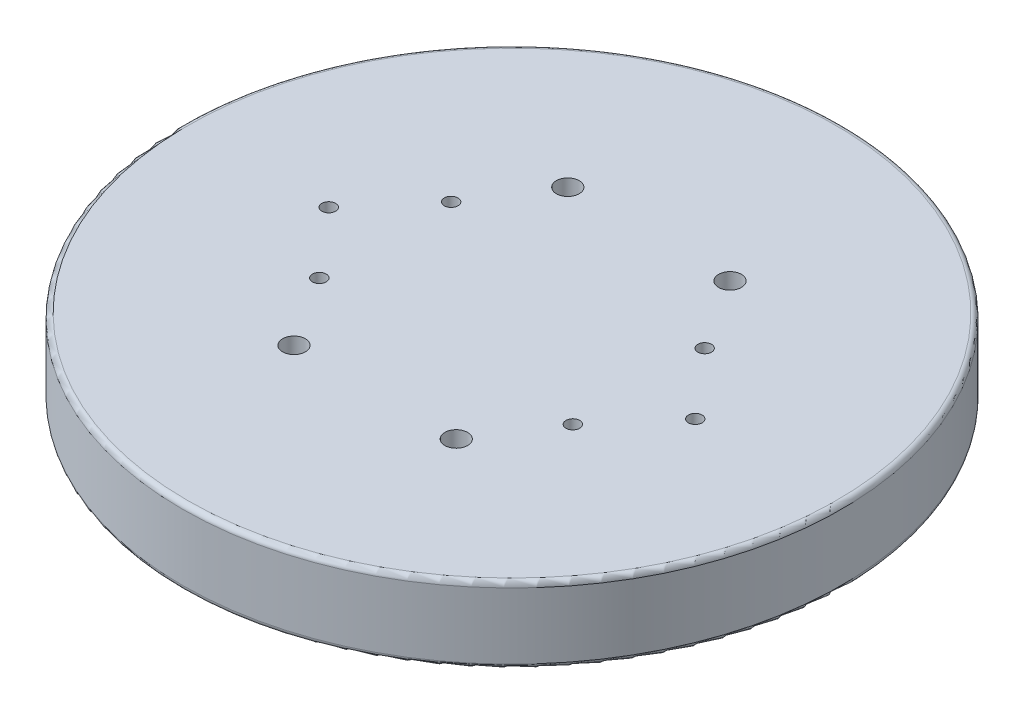
ISO-10303-21;
HEADER;
FILE_DESCRIPTION(('STEP AP214'),'2;1');
FILE_NAME('part.step','',(''),(''),'','','');
FILE_SCHEMA(('AUTOMOTIVE_DESIGN { 1 0 10303 214 1 1 1 1 }'));
ENDSEC;
DATA;
#1=APPLICATION_CONTEXT('core data for automotive mechanical design processes');
#2=APPLICATION_PROTOCOL_DEFINITION('international standard','automotive_design',2000,#1);
#3=PRODUCT_CONTEXT('',#1,'mechanical');
#4=PRODUCT('Part','Part','',(#3));
#5=PRODUCT_RELATED_PRODUCT_CATEGORY('part','',(#4));
#6=PRODUCT_DEFINITION_FORMATION('','',#4);
#7=PRODUCT_DEFINITION_CONTEXT('part definition',#1,'design');
#8=PRODUCT_DEFINITION('design','',#6,#7);
#9=PRODUCT_DEFINITION_SHAPE('','',#8);
#10=(LENGTH_UNIT() NAMED_UNIT(*) SI_UNIT(.MILLI.,.METRE.));
#11=(NAMED_UNIT(*) PLANE_ANGLE_UNIT() SI_UNIT($,.RADIAN.));
#12=(NAMED_UNIT(*) SI_UNIT($,.STERADIAN.) SOLID_ANGLE_UNIT());
#13=UNCERTAINTY_MEASURE_WITH_UNIT(LENGTH_MEASURE(1.E-05),#10,'distance_accuracy_value','');
#14=(GEOMETRIC_REPRESENTATION_CONTEXT(3) GLOBAL_UNCERTAINTY_ASSIGNED_CONTEXT((#13)) GLOBAL_UNIT_ASSIGNED_CONTEXT((#10,
#11,#12)) REPRESENTATION_CONTEXT('',''));
#15=CARTESIAN_POINT('',(0.,0.,0.));
#16=DIRECTION('',(0.,0.,1.));
#17=DIRECTION('',(1.,0.,0.));
#18=AXIS2_PLACEMENT_3D('',#15,#16,#17);
#19=CARTESIAN_POINT('',(0.,15.,0.));
#20=DIRECTION('',(0.,1.,0.));
#21=DIRECTION('',(0.,0.,1.));
#22=AXIS2_PLACEMENT_3D('',#19,#20,#21);
#23=PLANE('',#22);
#24=CARTESIAN_POINT('',(-16.,15.,27.));
#25=DIRECTION('',(0.,-1.,0.));
#26=DIRECTION('',(0.,0.,-1.));
#27=AXIS2_PLACEMENT_3D('',#24,#25,#26);
#28=CIRCLE('',#27,2.2479);
#29=CARTESIAN_POINT('',(-16.,15.,24.7521));
#30=VERTEX_POINT('',#29);
#31=EDGE_CURVE('E107',#30,#30,#28,.T.);
#32=ORIENTED_EDGE('',*,*,#31,.T.);
#33=EDGE_LOOP('',(#32));
#34=FACE_BOUND('',#33,.T.);
#35=CARTESIAN_POINT('',(16.,15.,27.));
#36=DIRECTION('',(0.,-1.,0.));
#37=DIRECTION('',(0.,0.,-1.));
#38=AXIS2_PLACEMENT_3D('',#35,#36,#37);
#39=CIRCLE('',#38,2.24789999999999);
#40=CARTESIAN_POINT('',(16.,15.,24.7521));
#41=VERTEX_POINT('',#40);
#42=EDGE_CURVE('E101',#41,#41,#39,.T.);
#43=ORIENTED_EDGE('',*,*,#42,.T.);
#44=EDGE_LOOP('',(#43));
#45=FACE_BOUND('',#44,.T.);
#46=CARTESIAN_POINT('',(25.,15.,13.));
#47=DIRECTION('',(0.,-1.,0.));
#48=DIRECTION('',(0.,0.,-1.));
#49=AXIS2_PLACEMENT_3D('',#46,#47,#48);
#50=CIRCLE('',#49,1.35254999999999);
#51=CARTESIAN_POINT('',(25.,15.,11.64745));
#52=VERTEX_POINT('',#51);
#53=EDGE_CURVE('E59',#52,#52,#50,.T.);
#54=ORIENTED_EDGE('',*,*,#53,.T.);
#55=EDGE_LOOP('',(#54));
#56=FACE_BOUND('',#55,.T.);
#57=CARTESIAN_POINT('',(25.,15.,-13.));
#58=DIRECTION('',(0.,-1.,0.));
#59=DIRECTION('',(0.,0.,-1.));
#60=AXIS2_PLACEMENT_3D('',#57,#58,#59);
#61=CIRCLE('',#60,1.35254999999999);
#62=CARTESIAN_POINT('',(25.,15.,-14.35255));
#63=VERTEX_POINT('',#62);
#64=EDGE_CURVE('E53',#63,#63,#61,.T.);
#65=ORIENTED_EDGE('',*,*,#64,.T.);
#66=EDGE_LOOP('',(#65));
#67=FACE_BOUND('',#66,.T.);
#68=CARTESIAN_POINT('',(0.,15.,0.));
#69=DIRECTION('',(0.,1.,0.));
#70=DIRECTION('',(0.,0.,1.));
#71=AXIS2_PLACEMENT_3D('',#68,#69,#70);
#72=CIRCLE('',#71,64.);
#73=CARTESIAN_POINT('',(0.,15.,64.));
#74=VERTEX_POINT('',#73);
#75=EDGE_CURVE('E10',#74,#74,#72,.T.);
#76=ORIENTED_EDGE('',*,*,#75,.T.);
#77=EDGE_LOOP('',(#76));
#78=FACE_BOUND('',#77,.T.);
#79=CARTESIAN_POINT('',(-25.,15.,13.));
#80=DIRECTION('',(0.,-1.,0.));
#81=DIRECTION('',(0.,0.,-1.));
#82=AXIS2_PLACEMENT_3D('',#79,#80,#81);
#83=CIRCLE('',#82,1.35254999999999);
#84=CARTESIAN_POINT('',(-25.,15.,11.64745));
#85=VERTEX_POINT('',#84);
#86=EDGE_CURVE('E65',#85,#85,#83,.T.);
#87=ORIENTED_EDGE('',*,*,#86,.T.);
#88=EDGE_LOOP('',(#87));
#89=FACE_BOUND('',#88,.T.);
#90=CARTESIAN_POINT('',(-25.,15.,-13.));
#91=DIRECTION('',(0.,-1.,0.));
#92=DIRECTION('',(0.,0.,-1.));
#93=AXIS2_PLACEMENT_3D('',#90,#91,#92);
#94=CIRCLE('',#93,1.35254999999999);
#95=CARTESIAN_POINT('',(-25.,15.,-14.35255));
#96=VERTEX_POINT('',#95);
#97=EDGE_CURVE('E71',#96,#96,#94,.T.);
#98=ORIENTED_EDGE('',*,*,#97,.T.);
#99=EDGE_LOOP('',(#98));
#100=FACE_BOUND('',#99,.T.);
#101=CARTESIAN_POINT('',(36.145,15.,0.));
#102=DIRECTION('',(0.,-1.,0.));
#103=DIRECTION('',(0.,0.,-1.));
#104=AXIS2_PLACEMENT_3D('',#101,#102,#103);
#105=CIRCLE('',#104,1.35254999999999);
#106=CARTESIAN_POINT('',(36.145,15.,-1.35254999999999));
#107=VERTEX_POINT('',#106);
#108=EDGE_CURVE('E77',#107,#107,#105,.T.);
#109=ORIENTED_EDGE('',*,*,#108,.T.);
#110=EDGE_LOOP('',(#109));
#111=FACE_BOUND('',#110,.T.);
#112=CARTESIAN_POINT('',(-36.145,15.,0.));
#113=DIRECTION('',(0.,-1.,0.));
#114=DIRECTION('',(0.,0.,-1.));
#115=AXIS2_PLACEMENT_3D('',#112,#113,#114);
#116=CIRCLE('',#115,1.35254999999999);
#117=CARTESIAN_POINT('',(-36.145,15.,-1.35254999999999));
#118=VERTEX_POINT('',#117);
#119=EDGE_CURVE('E83',#118,#118,#116,.T.);
#120=ORIENTED_EDGE('',*,*,#119,.T.);
#121=EDGE_LOOP('',(#120));
#122=FACE_BOUND('',#121,.T.);
#123=CARTESIAN_POINT('',(16.,15.,-27.));
#124=DIRECTION('',(0.,-1.,0.));
#125=DIRECTION('',(0.,0.,-1.));
#126=AXIS2_PLACEMENT_3D('',#123,#124,#125);
#127=CIRCLE('',#126,2.24789999999999);
#128=CARTESIAN_POINT('',(16.,15.,-29.2479));
#129=VERTEX_POINT('',#128);
#130=EDGE_CURVE('E89',#129,#129,#127,.T.);
#131=ORIENTED_EDGE('',*,*,#130,.T.);
#132=EDGE_LOOP('',(#131));
#133=FACE_BOUND('',#132,.T.);
#134=CARTESIAN_POINT('',(-16.,15.,-27.));
#135=DIRECTION('',(0.,-1.,0.));
#136=DIRECTION('',(0.,0.,-1.));
#137=AXIS2_PLACEMENT_3D('',#134,#135,#136);
#138=CIRCLE('',#137,2.2479);
#139=CARTESIAN_POINT('',(-16.,15.,-29.2479));
#140=VERTEX_POINT('',#139);
#141=EDGE_CURVE('E95',#140,#140,#138,.T.);
#142=ORIENTED_EDGE('',*,*,#141,.T.);
#143=EDGE_LOOP('',(#142));
#144=FACE_BOUND('',#143,.T.);
#145=ADVANCED_FACE('F33',(#34,#45,#56,#67,#78,#89,#100,#111,#122,#133,#144),#23,.T.);
#146=CARTESIAN_POINT('',(0.,0.,0.));
#147=DIRECTION('',(0.,1.,0.));
#148=DIRECTION('',(0.,0.,1.));
#149=AXIS2_PLACEMENT_3D('',#146,#147,#148);
#150=PLANE('',#149);
#151=CARTESIAN_POINT('',(-16.,0.,27.));
#152=DIRECTION('',(0.,-1.,0.));
#153=DIRECTION('',(0.,0.,-1.));
#154=AXIS2_PLACEMENT_3D('',#151,#152,#153);
#155=CIRCLE('',#154,2.2479);
#156=CARTESIAN_POINT('',(-16.,0.,24.7521));
#157=VERTEX_POINT('',#156);
#158=EDGE_CURVE('E110',#157,#157,#155,.T.);
#159=ORIENTED_EDGE('',*,*,#158,.F.);
#160=EDGE_LOOP('',(#159));
#161=FACE_BOUND('',#160,.T.);
#162=CARTESIAN_POINT('',(16.,0.,27.));
#163=DIRECTION('',(0.,-1.,0.));
#164=DIRECTION('',(0.,0.,-1.));
#165=AXIS2_PLACEMENT_3D('',#162,#163,#164);
#166=CIRCLE('',#165,2.2479);
#167=CARTESIAN_POINT('',(16.,0.,24.7521));
#168=VERTEX_POINT('',#167);
#169=EDGE_CURVE('E104',#168,#168,#166,.T.);
#170=ORIENTED_EDGE('',*,*,#169,.F.);
#171=EDGE_LOOP('',(#170));
#172=FACE_BOUND('',#171,.T.);
#173=CARTESIAN_POINT('',(-16.,0.,-27.));
#174=DIRECTION('',(0.,-1.,0.));
#175=DIRECTION('',(0.,0.,-1.));
#176=AXIS2_PLACEMENT_3D('',#173,#174,#175);
#177=CIRCLE('',#176,2.2479);
#178=CARTESIAN_POINT('',(-16.,0.,-29.2479));
#179=VERTEX_POINT('',#178);
#180=EDGE_CURVE('E98',#179,#179,#177,.T.);
#181=ORIENTED_EDGE('',*,*,#180,.F.);
#182=EDGE_LOOP('',(#181));
#183=FACE_BOUND('',#182,.T.);
#184=CARTESIAN_POINT('',(-36.145,0.,0.));
#185=DIRECTION('',(0.,-1.,0.));
#186=DIRECTION('',(0.,0.,-1.));
#187=AXIS2_PLACEMENT_3D('',#184,#185,#186);
#188=CIRCLE('',#187,1.35255);
#189=CARTESIAN_POINT('',(-36.145,0.,-1.35255));
#190=VERTEX_POINT('',#189);
#191=EDGE_CURVE('E86',#190,#190,#188,.T.);
#192=ORIENTED_EDGE('',*,*,#191,.F.);
#193=EDGE_LOOP('',(#192));
#194=FACE_BOUND('',#193,.T.);
#195=CARTESIAN_POINT('',(36.145,0.,0.));
#196=DIRECTION('',(0.,-1.,0.));
#197=DIRECTION('',(0.,0.,-1.));
#198=AXIS2_PLACEMENT_3D('',#195,#196,#197);
#199=CIRCLE('',#198,1.35255);
#200=CARTESIAN_POINT('',(36.145,0.,-1.35255));
#201=VERTEX_POINT('',#200);
#202=EDGE_CURVE('E80',#201,#201,#199,.T.);
#203=ORIENTED_EDGE('',*,*,#202,.F.);
#204=EDGE_LOOP('',(#203));
#205=FACE_BOUND('',#204,.T.);
#206=CARTESIAN_POINT('',(-25.,0.,-13.));
#207=DIRECTION('',(0.,-1.,0.));
#208=DIRECTION('',(0.,0.,-1.));
#209=AXIS2_PLACEMENT_3D('',#206,#207,#208);
#210=CIRCLE('',#209,1.35255);
#211=CARTESIAN_POINT('',(-25.,0.,-14.35255));
#212=VERTEX_POINT('',#211);
#213=EDGE_CURVE('E74',#212,#212,#210,.T.);
#214=ORIENTED_EDGE('',*,*,#213,.F.);
#215=EDGE_LOOP('',(#214));
#216=FACE_BOUND('',#215,.T.);
#217=CARTESIAN_POINT('',(-25.,0.,13.));
#218=DIRECTION('',(0.,-1.,0.));
#219=DIRECTION('',(0.,0.,-1.));
#220=AXIS2_PLACEMENT_3D('',#217,#218,#219);
#221=CIRCLE('',#220,1.35255);
#222=CARTESIAN_POINT('',(-25.,0.,11.64745));
#223=VERTEX_POINT('',#222);
#224=EDGE_CURVE('E68',#223,#223,#221,.T.);
#225=ORIENTED_EDGE('',*,*,#224,.F.);
#226=EDGE_LOOP('',(#225));
#227=FACE_BOUND('',#226,.T.);
#228=CARTESIAN_POINT('',(25.,0.,13.));
#229=DIRECTION('',(0.,-1.,0.));
#230=DIRECTION('',(0.,0.,-1.));
#231=AXIS2_PLACEMENT_3D('',#228,#229,#230);
#232=CIRCLE('',#231,1.35255);
#233=CARTESIAN_POINT('',(25.,0.,11.64745));
#234=VERTEX_POINT('',#233);
#235=EDGE_CURVE('E62',#234,#234,#232,.T.);
#236=ORIENTED_EDGE('',*,*,#235,.F.);
#237=EDGE_LOOP('',(#236));
#238=FACE_BOUND('',#237,.T.);
#239=CARTESIAN_POINT('',(25.,0.,-13.));
#240=DIRECTION('',(0.,-1.,0.));
#241=DIRECTION('',(0.,0.,-1.));
#242=AXIS2_PLACEMENT_3D('',#239,#240,#241);
#243=CIRCLE('',#242,1.35255);
#244=CARTESIAN_POINT('',(25.,0.,-14.35255));
#245=VERTEX_POINT('',#244);
#246=EDGE_CURVE('E56',#245,#245,#243,.T.);
#247=ORIENTED_EDGE('',*,*,#246,.F.);
#248=EDGE_LOOP('',(#247));
#249=FACE_BOUND('',#248,.T.);
#250=CARTESIAN_POINT('',(0.,0.,0.));
#251=DIRECTION('',(0.,1.,0.));
#252=DIRECTION('',(0.,0.,1.));
#253=AXIS2_PLACEMENT_3D('',#250,#251,#252);
#254=CIRCLE('',#253,64.);
#255=CARTESIAN_POINT('',(0.,0.,64.));
#256=VERTEX_POINT('',#255);
#257=EDGE_CURVE('E40',#256,#256,#254,.F.);
#258=ORIENTED_EDGE('',*,*,#257,.T.);
#259=EDGE_LOOP('',(#258));
#260=FACE_BOUND('',#259,.T.);
#261=CARTESIAN_POINT('',(16.,0.,-27.));
#262=DIRECTION('',(0.,-1.,0.));
#263=DIRECTION('',(0.,0.,-1.));
#264=AXIS2_PLACEMENT_3D('',#261,#262,#263);
#265=CIRCLE('',#264,2.2479);
#266=CARTESIAN_POINT('',(16.,0.,-29.2479));
#267=VERTEX_POINT('',#266);
#268=EDGE_CURVE('E92',#267,#267,#265,.T.);
#269=ORIENTED_EDGE('',*,*,#268,.F.);
#270=EDGE_LOOP('',(#269));
#271=FACE_BOUND('',#270,.T.);
#272=ADVANCED_FACE('F116',(#161,#172,#183,#194,#205,#216,#227,#238,#249,#260,#271),#150,.F.);
#273=CARTESIAN_POINT('',(0.,15.,0.));
#274=DIRECTION('',(0.,-1.,0.));
#275=DIRECTION('',(0.,0.,-1.));
#276=AXIS2_PLACEMENT_3D('',#273,#274,#275);
#277=CYLINDRICAL_SURFACE('',#276,65.);
#278=CARTESIAN_POINT('',(0.,1.,0.));
#279=DIRECTION('',(0.,1.,0.));
#280=DIRECTION('',(0.,0.,1.));
#281=AXIS2_PLACEMENT_3D('',#278,#279,#280);
#282=CIRCLE('',#281,65.);
#283=CARTESIAN_POINT('',(0.,1.,65.));
#284=VERTEX_POINT('',#283);
#285=EDGE_CURVE('E44',#284,#284,#282,.T.);
#286=ORIENTED_EDGE('',*,*,#285,.T.);
#287=EDGE_LOOP('',(#286));
#288=FACE_BOUND('',#287,.T.);
#289=CARTESIAN_POINT('',(0.,14.,0.));
#290=DIRECTION('',(0.,1.,0.));
#291=DIRECTION('',(0.,0.,1.));
#292=AXIS2_PLACEMENT_3D('',#289,#290,#291);
#293=CIRCLE('',#292,65.);
#294=CARTESIAN_POINT('',(0.,14.,65.));
#295=VERTEX_POINT('',#294);
#296=EDGE_CURVE('E48',#295,#295,#293,.F.);
#297=ORIENTED_EDGE('',*,*,#296,.T.);
#298=EDGE_LOOP('',(#297));
#299=FACE_BOUND('',#298,.T.);
#300=ADVANCED_FACE('F119',(#288,#299),#277,.T.);
#301=CARTESIAN_POINT('',(0.,1.,0.));
#302=DIRECTION('',(0.,1.,0.));
#303=DIRECTION('',(0.,0.,1.));
#304=AXIS2_PLACEMENT_3D('',#301,#302,#303);
#305=TOROIDAL_SURFACE('',#304,64.,1.);
#306=ORIENTED_EDGE('',*,*,#257,.F.);
#307=EDGE_LOOP('',(#306));
#308=FACE_BOUND('',#307,.T.);
#309=ORIENTED_EDGE('',*,*,#285,.F.);
#310=EDGE_LOOP('',(#309));
#311=FACE_BOUND('',#310,.T.);
#312=ADVANCED_FACE('F167',(#308,#311),#305,.T.);
#313=CARTESIAN_POINT('',(0.,14.,0.));
#314=DIRECTION('',(0.,1.,0.));
#315=DIRECTION('',(0.,0.,1.));
#316=AXIS2_PLACEMENT_3D('',#313,#314,#315);
#317=TOROIDAL_SURFACE('',#316,64.,1.);
#318=ORIENTED_EDGE('',*,*,#296,.F.);
#319=EDGE_LOOP('',(#318));
#320=FACE_BOUND('',#319,.T.);
#321=ORIENTED_EDGE('',*,*,#75,.F.);
#322=EDGE_LOOP('',(#321));
#323=FACE_BOUND('',#322,.T.);
#324=ADVANCED_FACE('F35',(#320,#323),#317,.T.);
#325=CARTESIAN_POINT('',(25.,0.,-13.));
#326=DIRECTION('',(0.,-1.,0.));
#327=DIRECTION('',(0.,0.,-1.));
#328=AXIS2_PLACEMENT_3D('',#325,#326,#327);
#329=CYLINDRICAL_SURFACE('',#328,1.35255);
#330=ORIENTED_EDGE('',*,*,#64,.F.);
#331=EDGE_LOOP('',(#330));
#332=FACE_BOUND('',#331,.T.);
#333=ORIENTED_EDGE('',*,*,#246,.T.);
#334=EDGE_LOOP('',(#333));
#335=FACE_BOUND('',#334,.T.);
#336=ADVANCED_FACE('F163',(#332,#335),#329,.F.);
#337=CARTESIAN_POINT('',(25.,0.,13.));
#338=DIRECTION('',(0.,-1.,0.));
#339=DIRECTION('',(0.,0.,-1.));
#340=AXIS2_PLACEMENT_3D('',#337,#338,#339);
#341=CYLINDRICAL_SURFACE('',#340,1.35255);
#342=ORIENTED_EDGE('',*,*,#53,.F.);
#343=EDGE_LOOP('',(#342));
#344=FACE_BOUND('',#343,.T.);
#345=ORIENTED_EDGE('',*,*,#235,.T.);
#346=EDGE_LOOP('',(#345));
#347=FACE_BOUND('',#346,.T.);
#348=ADVANCED_FACE('F183',(#344,#347),#341,.F.);
#349=CARTESIAN_POINT('',(-25.,0.,13.));
#350=DIRECTION('',(0.,-1.,0.));
#351=DIRECTION('',(0.,0.,-1.));
#352=AXIS2_PLACEMENT_3D('',#349,#350,#351);
#353=CYLINDRICAL_SURFACE('',#352,1.35255);
#354=ORIENTED_EDGE('',*,*,#86,.F.);
#355=EDGE_LOOP('',(#354));
#356=FACE_BOUND('',#355,.T.);
#357=ORIENTED_EDGE('',*,*,#224,.T.);
#358=EDGE_LOOP('',(#357));
#359=FACE_BOUND('',#358,.T.);
#360=ADVANCED_FACE('F188',(#356,#359),#353,.F.);
#361=CARTESIAN_POINT('',(-25.,0.,-13.));
#362=DIRECTION('',(0.,-1.,0.));
#363=DIRECTION('',(0.,0.,-1.));
#364=AXIS2_PLACEMENT_3D('',#361,#362,#363);
#365=CYLINDRICAL_SURFACE('',#364,1.35255);
#366=ORIENTED_EDGE('',*,*,#97,.F.);
#367=EDGE_LOOP('',(#366));
#368=FACE_BOUND('',#367,.T.);
#369=ORIENTED_EDGE('',*,*,#213,.T.);
#370=EDGE_LOOP('',(#369));
#371=FACE_BOUND('',#370,.T.);
#372=ADVANCED_FACE('F209',(#368,#371),#365,.F.);
#373=CARTESIAN_POINT('',(36.145,0.,0.));
#374=DIRECTION('',(0.,-1.,0.));
#375=DIRECTION('',(0.,0.,-1.));
#376=AXIS2_PLACEMENT_3D('',#373,#374,#375);
#377=CYLINDRICAL_SURFACE('',#376,1.35255);
#378=ORIENTED_EDGE('',*,*,#108,.F.);
#379=EDGE_LOOP('',(#378));
#380=FACE_BOUND('',#379,.T.);
#381=ORIENTED_EDGE('',*,*,#202,.T.);
#382=EDGE_LOOP('',(#381));
#383=FACE_BOUND('',#382,.T.);
#384=ADVANCED_FACE('F152',(#380,#383),#377,.F.);
#385=CARTESIAN_POINT('',(-36.145,0.,0.));
#386=DIRECTION('',(0.,-1.,0.));
#387=DIRECTION('',(0.,0.,-1.));
#388=AXIS2_PLACEMENT_3D('',#385,#386,#387);
#389=CYLINDRICAL_SURFACE('',#388,1.35255);
#390=ORIENTED_EDGE('',*,*,#119,.F.);
#391=EDGE_LOOP('',(#390));
#392=FACE_BOUND('',#391,.T.);
#393=ORIENTED_EDGE('',*,*,#191,.T.);
#394=EDGE_LOOP('',(#393));
#395=FACE_BOUND('',#394,.T.);
#396=ADVANCED_FACE('F142',(#392,#395),#389,.F.);
#397=CARTESIAN_POINT('',(16.,0.,-27.));
#398=DIRECTION('',(0.,-1.,0.));
#399=DIRECTION('',(0.,0.,-1.));
#400=AXIS2_PLACEMENT_3D('',#397,#398,#399);
#401=CYLINDRICAL_SURFACE('',#400,2.2479);
#402=ORIENTED_EDGE('',*,*,#130,.F.);
#403=EDGE_LOOP('',(#402));
#404=FACE_BOUND('',#403,.T.);
#405=ORIENTED_EDGE('',*,*,#268,.T.);
#406=EDGE_LOOP('',(#405));
#407=FACE_BOUND('',#406,.T.);
#408=ADVANCED_FACE('F139',(#404,#407),#401,.F.);
#409=CARTESIAN_POINT('',(-16.,0.,-27.));
#410=DIRECTION('',(0.,-1.,0.));
#411=DIRECTION('',(0.,0.,-1.));
#412=AXIS2_PLACEMENT_3D('',#409,#410,#411);
#413=CYLINDRICAL_SURFACE('',#412,2.2479);
#414=ORIENTED_EDGE('',*,*,#141,.F.);
#415=EDGE_LOOP('',(#414));
#416=FACE_BOUND('',#415,.T.);
#417=ORIENTED_EDGE('',*,*,#180,.T.);
#418=EDGE_LOOP('',(#417));
#419=FACE_BOUND('',#418,.T.);
#420=ADVANCED_FACE('F141',(#416,#419),#413,.F.);
#421=CARTESIAN_POINT('',(16.,0.,27.));
#422=DIRECTION('',(0.,-1.,0.));
#423=DIRECTION('',(0.,0.,-1.));
#424=AXIS2_PLACEMENT_3D('',#421,#422,#423);
#425=CYLINDRICAL_SURFACE('',#424,2.2479);
#426=ORIENTED_EDGE('',*,*,#42,.F.);
#427=EDGE_LOOP('',(#426));
#428=FACE_BOUND('',#427,.T.);
#429=ORIENTED_EDGE('',*,*,#169,.T.);
#430=EDGE_LOOP('',(#429));
#431=FACE_BOUND('',#430,.T.);
#432=ADVANCED_FACE('F149',(#428,#431),#425,.F.);
#433=CARTESIAN_POINT('',(-16.,0.,27.));
#434=DIRECTION('',(0.,-1.,0.));
#435=DIRECTION('',(0.,0.,-1.));
#436=AXIS2_PLACEMENT_3D('',#433,#434,#435);
#437=CYLINDRICAL_SURFACE('',#436,2.2479);
#438=ORIENTED_EDGE('',*,*,#31,.F.);
#439=EDGE_LOOP('',(#438));
#440=FACE_BOUND('',#439,.T.);
#441=ORIENTED_EDGE('',*,*,#158,.T.);
#442=EDGE_LOOP('',(#441));
#443=FACE_BOUND('',#442,.T.);
#444=ADVANCED_FACE('F114',(#440,#443),#437,.F.);
#445=CLOSED_SHELL('',(#145,#272,#300,#312,#324,#336,#348,#360,#372,#384,#396,#408,#420,#432,#444));
#446=MANIFOLD_SOLID_BREP('B2',#445);
#447=ADVANCED_BREP_SHAPE_REPRESENTATION('',(#18,#446),#14);
#448=SHAPE_DEFINITION_REPRESENTATION(#9,#447);
ENDSEC;
END-ISO-10303-21;
